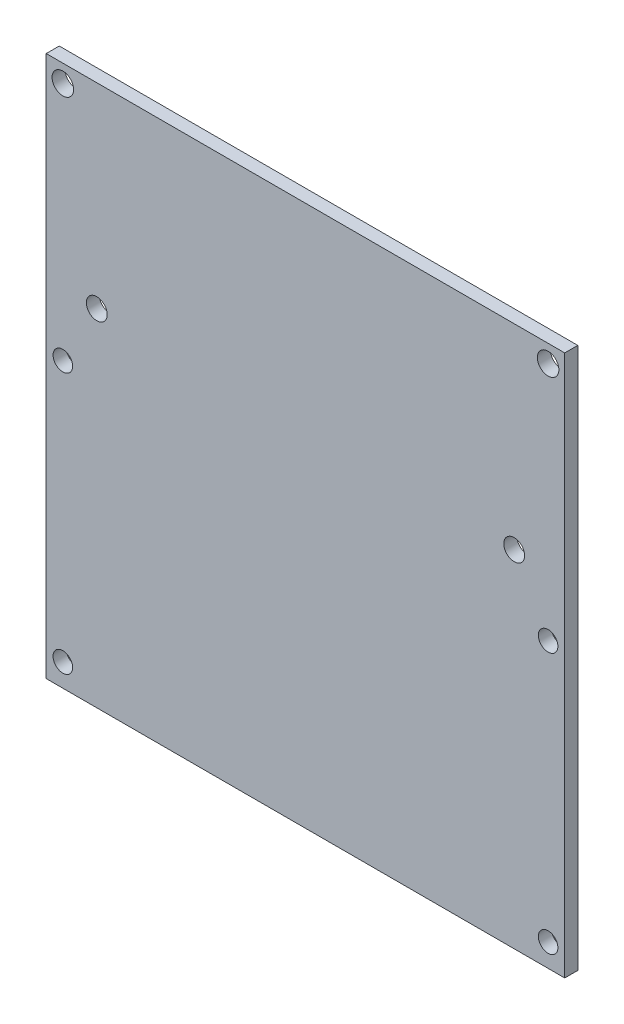
ISO-10303-21;
HEADER;
FILE_DESCRIPTION(('STEP AP214'),'2;1');
FILE_NAME('part.step','',(''),(''),'','','');
FILE_SCHEMA(('AUTOMOTIVE_DESIGN { 1 0 10303 214 1 1 1 1 }'));
ENDSEC;
DATA;
#1=APPLICATION_CONTEXT('core data for automotive mechanical design processes');
#2=APPLICATION_PROTOCOL_DEFINITION('international standard','automotive_design',2000,#1);
#3=PRODUCT_CONTEXT('',#1,'mechanical');
#4=PRODUCT('Part','Part','',(#3));
#5=PRODUCT_RELATED_PRODUCT_CATEGORY('part','',(#4));
#6=PRODUCT_DEFINITION_FORMATION('','',#4);
#7=PRODUCT_DEFINITION_CONTEXT('part definition',#1,'design');
#8=PRODUCT_DEFINITION('design','',#6,#7);
#9=PRODUCT_DEFINITION_SHAPE('','',#8);
#10=(LENGTH_UNIT() NAMED_UNIT(*) SI_UNIT(.MILLI.,.METRE.));
#11=(NAMED_UNIT(*) PLANE_ANGLE_UNIT() SI_UNIT($,.RADIAN.));
#12=(NAMED_UNIT(*) SI_UNIT($,.STERADIAN.) SOLID_ANGLE_UNIT());
#13=UNCERTAINTY_MEASURE_WITH_UNIT(LENGTH_MEASURE(1.E-05),#10,'distance_accuracy_value','');
#14=(GEOMETRIC_REPRESENTATION_CONTEXT(3) GLOBAL_UNCERTAINTY_ASSIGNED_CONTEXT((#13)) GLOBAL_UNIT_ASSIGNED_CONTEXT((#10,
#11,#12)) REPRESENTATION_CONTEXT('',''));
#15=CARTESIAN_POINT('',(0.,0.,0.));
#16=DIRECTION('',(0.,0.,1.));
#17=DIRECTION('',(1.,0.,0.));
#18=AXIS2_PLACEMENT_3D('',#15,#16,#17);
#19=CARTESIAN_POINT('',(0.,0.,2.));
#20=DIRECTION('',(0.,-1.,0.));
#21=DIRECTION('',(0.,0.,-1.));
#22=AXIS2_PLACEMENT_3D('',#19,#20,#21);
#23=PLANE('',#22);
#24=DIRECTION('',(-1.,0.,0.));
#25=VECTOR('',#24,1.);
#26=CARTESIAN_POINT('',(0.,0.,0.));
#27=LINE('',#26,#25);
#28=CARTESIAN_POINT('',(79.5,0.,0.));
#29=VERTEX_POINT('',#28);
#30=CARTESIAN_POINT('',(0.,0.,0.));
#31=VERTEX_POINT('',#30);
#32=EDGE_CURVE('E116',#29,#31,#27,.T.);
#33=ORIENTED_EDGE('',*,*,#32,.T.);
#34=DIRECTION('',(0.,0.,-1.));
#35=VECTOR('',#34,1.);
#36=CARTESIAN_POINT('',(0.,0.,2.));
#37=LINE('',#36,#35);
#38=CARTESIAN_POINT('',(0.,0.,2.));
#39=VERTEX_POINT('',#38);
#40=EDGE_CURVE('E11',#39,#31,#37,.T.);
#41=ORIENTED_EDGE('',*,*,#40,.F.);
#42=DIRECTION('',(-1.,0.,0.));
#43=VECTOR('',#42,1.);
#44=CARTESIAN_POINT('',(0.,0.,2.));
#45=LINE('',#44,#43);
#46=CARTESIAN_POINT('',(79.5,0.,2.));
#47=VERTEX_POINT('',#46);
#48=EDGE_CURVE('E99',#47,#39,#45,.T.);
#49=ORIENTED_EDGE('',*,*,#48,.F.);
#50=DIRECTION('',(0.,0.,-1.));
#51=VECTOR('',#50,1.);
#52=CARTESIAN_POINT('',(79.5,0.,2.));
#53=LINE('',#52,#51);
#54=EDGE_CURVE('E112',#47,#29,#53,.T.);
#55=ORIENTED_EDGE('',*,*,#54,.T.);
#56=EDGE_LOOP('',(#33,#41,#49,#55));
#57=FACE_BOUND('',#56,.T.);
#58=ADVANCED_FACE('F45',(#57),#23,.F.);
#59=CARTESIAN_POINT('',(0.,0.,2.));
#60=DIRECTION('',(1.,0.,0.));
#61=DIRECTION('',(0.,1.,0.));
#62=AXIS2_PLACEMENT_3D('',#59,#60,#61);
#63=PLANE('',#62);
#64=DIRECTION('',(0.,-1.,0.));
#65=VECTOR('',#64,1.);
#66=CARTESIAN_POINT('',(0.,0.,0.));
#67=LINE('',#66,#65);
#68=CARTESIAN_POINT('',(0.,-83.,0.));
#69=VERTEX_POINT('',#68);
#70=EDGE_CURVE('E104',#31,#69,#67,.T.);
#71=ORIENTED_EDGE('',*,*,#70,.T.);
#72=DIRECTION('',(0.,0.,-1.));
#73=VECTOR('',#72,1.);
#74=CARTESIAN_POINT('',(0.,-83.,2.));
#75=LINE('',#74,#73);
#76=CARTESIAN_POINT('',(0.,-83.,2.));
#77=VERTEX_POINT('',#76);
#78=EDGE_CURVE('E55',#77,#69,#75,.T.);
#79=ORIENTED_EDGE('',*,*,#78,.F.);
#80=DIRECTION('',(0.,-1.,0.));
#81=VECTOR('',#80,1.);
#82=CARTESIAN_POINT('',(0.,0.,2.));
#83=LINE('',#82,#81);
#84=EDGE_CURVE('E94',#39,#77,#83,.T.);
#85=ORIENTED_EDGE('',*,*,#84,.F.);
#86=ORIENTED_EDGE('',*,*,#40,.T.);
#87=EDGE_LOOP('',(#71,#79,#85,#86));
#88=FACE_BOUND('',#87,.T.);
#89=ADVANCED_FACE('F103',(#88),#63,.F.);
#90=CARTESIAN_POINT('',(79.5,-83.,2.));
#91=DIRECTION('',(0.,1.,0.));
#92=DIRECTION('',(0.,0.,1.));
#93=AXIS2_PLACEMENT_3D('',#90,#91,#92);
#94=PLANE('',#93);
#95=DIRECTION('',(1.,0.,0.));
#96=VECTOR('',#95,1.);
#97=CARTESIAN_POINT('',(79.5,-83.,0.));
#98=LINE('',#97,#96);
#99=CARTESIAN_POINT('',(79.5,-83.,0.));
#100=VERTEX_POINT('',#99);
#101=EDGE_CURVE('E81',#69,#100,#98,.T.);
#102=ORIENTED_EDGE('',*,*,#101,.T.);
#103=DIRECTION('',(0.,0.,-1.));
#104=VECTOR('',#103,1.);
#105=CARTESIAN_POINT('',(79.5,-83.,2.));
#106=LINE('',#105,#104);
#107=CARTESIAN_POINT('',(79.5,-83.,2.));
#108=VERTEX_POINT('',#107);
#109=EDGE_CURVE('E106',#108,#100,#106,.T.);
#110=ORIENTED_EDGE('',*,*,#109,.F.);
#111=DIRECTION('',(1.,0.,0.));
#112=VECTOR('',#111,1.);
#113=CARTESIAN_POINT('',(79.5,-83.,2.));
#114=LINE('',#113,#112);
#115=EDGE_CURVE('E97',#77,#108,#114,.T.);
#116=ORIENTED_EDGE('',*,*,#115,.F.);
#117=ORIENTED_EDGE('',*,*,#78,.T.);
#118=EDGE_LOOP('',(#102,#110,#116,#117));
#119=FACE_BOUND('',#118,.T.);
#120=ADVANCED_FACE('F108',(#119),#94,.F.);
#121=CARTESIAN_POINT('',(79.5,0.,2.));
#122=DIRECTION('',(-1.,0.,0.));
#123=DIRECTION('',(0.,0.,1.));
#124=AXIS2_PLACEMENT_3D('',#121,#122,#123);
#125=PLANE('',#124);
#126=DIRECTION('',(0.,1.,0.));
#127=VECTOR('',#126,1.);
#128=CARTESIAN_POINT('',(79.5,0.,0.));
#129=LINE('',#128,#127);
#130=EDGE_CURVE('E87',#100,#29,#129,.T.);
#131=ORIENTED_EDGE('',*,*,#130,.T.);
#132=ORIENTED_EDGE('',*,*,#54,.F.);
#133=DIRECTION('',(0.,1.,0.));
#134=VECTOR('',#133,1.);
#135=CARTESIAN_POINT('',(79.5,0.,2.));
#136=LINE('',#135,#134);
#137=EDGE_CURVE('E64',#108,#47,#136,.T.);
#138=ORIENTED_EDGE('',*,*,#137,.F.);
#139=ORIENTED_EDGE('',*,*,#109,.T.);
#140=EDGE_LOOP('',(#131,#132,#138,#139));
#141=FACE_BOUND('',#140,.T.);
#142=ADVANCED_FACE('F175',(#141),#125,.F.);
#143=CARTESIAN_POINT('',(0.,0.,2.));
#144=DIRECTION('',(0.,0.,-1.));
#145=DIRECTION('',(-1.,0.,0.));
#146=AXIS2_PLACEMENT_3D('',#143,#144,#145);
#147=PLANE('',#146);
#148=CARTESIAN_POINT('',(7.75000000000001,-30.,2.));
#149=DIRECTION('',(0.,0.,-1.));
#150=DIRECTION('',(-1.,0.,0.));
#151=AXIS2_PLACEMENT_3D('',#148,#149,#150);
#152=CIRCLE('',#151,1.6);
#153=CARTESIAN_POINT('',(6.15000000000001,-30.,2.));
#154=VERTEX_POINT('',#153);
#155=EDGE_CURVE('E298',#154,#154,#152,.T.);
#156=ORIENTED_EDGE('',*,*,#155,.T.);
#157=EDGE_LOOP('',(#156));
#158=FACE_BOUND('',#157,.T.);
#159=CARTESIAN_POINT('',(71.75,-30.,2.));
#160=DIRECTION('',(0.,0.,-1.));
#161=DIRECTION('',(-1.,0.,0.));
#162=AXIS2_PLACEMENT_3D('',#159,#160,#161);
#163=CIRCLE('',#162,1.6);
#164=CARTESIAN_POINT('',(70.15,-30.,2.));
#165=VERTEX_POINT('',#164);
#166=EDGE_CURVE('E300',#165,#165,#163,.T.);
#167=ORIENTED_EDGE('',*,*,#166,.T.);
#168=EDGE_LOOP('',(#167));
#169=FACE_BOUND('',#168,.T.);
#170=CARTESIAN_POINT('',(2.55,-2.7,2.));
#171=DIRECTION('',(0.,0.,1.));
#172=DIRECTION('',(1.,0.,0.));
#173=AXIS2_PLACEMENT_3D('',#170,#171,#172);
#174=CIRCLE('',#173,1.65);
#175=CARTESIAN_POINT('',(4.2,-2.7,2.));
#176=VERTEX_POINT('',#175);
#177=EDGE_CURVE('E316',#176,#176,#174,.T.);
#178=ORIENTED_EDGE('',*,*,#177,.F.);
#179=EDGE_LOOP('',(#178));
#180=FACE_BOUND('',#179,.T.);
#181=CARTESIAN_POINT('',(76.95,-79.5,2.));
#182=DIRECTION('',(0.,0.,1.));
#183=DIRECTION('',(1.,0.,0.));
#184=AXIS2_PLACEMENT_3D('',#181,#182,#183);
#185=CIRCLE('',#184,1.5);
#186=CARTESIAN_POINT('',(78.45,-79.5,2.));
#187=VERTEX_POINT('',#186);
#188=EDGE_CURVE('E317',#187,#187,#185,.T.);
#189=ORIENTED_EDGE('',*,*,#188,.F.);
#190=EDGE_LOOP('',(#189));
#191=FACE_BOUND('',#190,.T.);
#192=CARTESIAN_POINT('',(76.95,-39.5,2.));
#193=DIRECTION('',(0.,0.,1.));
#194=DIRECTION('',(1.,0.,0.));
#195=AXIS2_PLACEMENT_3D('',#192,#193,#194);
#196=CIRCLE('',#195,1.5);
#197=CARTESIAN_POINT('',(78.45,-39.5,2.));
#198=VERTEX_POINT('',#197);
#199=EDGE_CURVE('E321',#198,#198,#196,.T.);
#200=ORIENTED_EDGE('',*,*,#199,.F.);
#201=EDGE_LOOP('',(#200));
#202=FACE_BOUND('',#201,.T.);
#203=CARTESIAN_POINT('',(2.55000000000001,-39.5,2.));
#204=DIRECTION('',(0.,0.,1.));
#205=DIRECTION('',(1.,0.,0.));
#206=AXIS2_PLACEMENT_3D('',#203,#204,#205);
#207=CIRCLE('',#206,1.5);
#208=CARTESIAN_POINT('',(4.05000000000001,-39.5,2.));
#209=VERTEX_POINT('',#208);
#210=EDGE_CURVE('E325',#209,#209,#207,.T.);
#211=ORIENTED_EDGE('',*,*,#210,.F.);
#212=EDGE_LOOP('',(#211));
#213=FACE_BOUND('',#212,.T.);
#214=CARTESIAN_POINT('',(76.95,-2.7,2.));
#215=DIRECTION('',(0.,0.,1.));
#216=DIRECTION('',(-1.,0.,0.));
#217=AXIS2_PLACEMENT_3D('',#214,#215,#216);
#218=CIRCLE('',#217,1.65);
#219=CARTESIAN_POINT('',(75.3,-2.7,2.));
#220=VERTEX_POINT('',#219);
#221=EDGE_CURVE('E304',#220,#220,#218,.T.);
#222=ORIENTED_EDGE('',*,*,#221,.F.);
#223=EDGE_LOOP('',(#222));
#224=FACE_BOUND('',#223,.T.);
#225=CARTESIAN_POINT('',(2.55000000000001,-79.5,2.));
#226=DIRECTION('',(0.,0.,1.));
#227=DIRECTION('',(1.,0.,0.));
#228=AXIS2_PLACEMENT_3D('',#225,#226,#227);
#229=CIRCLE('',#228,1.5);
#230=CARTESIAN_POINT('',(4.05000000000001,-79.5,2.));
#231=VERTEX_POINT('',#230);
#232=EDGE_CURVE('E135',#231,#231,#229,.T.);
#233=ORIENTED_EDGE('',*,*,#232,.F.);
#234=EDGE_LOOP('',(#233));
#235=FACE_BOUND('',#234,.T.);
#236=ORIENTED_EDGE('',*,*,#48,.T.);
#237=ORIENTED_EDGE('',*,*,#84,.T.);
#238=ORIENTED_EDGE('',*,*,#115,.T.);
#239=ORIENTED_EDGE('',*,*,#137,.T.);
#240=EDGE_LOOP('',(#236,#237,#238,#239));
#241=FACE_BOUND('',#240,.T.);
#242=ADVANCED_FACE('F95',(#158,#169,#180,#191,#202,#213,#224,#235,#241),#147,.F.);
#243=CARTESIAN_POINT('',(0.,0.,0.));
#244=DIRECTION('',(0.,0.,-1.));
#245=DIRECTION('',(-1.,0.,0.));
#246=AXIS2_PLACEMENT_3D('',#243,#244,#245);
#247=PLANE('',#246);
#248=CARTESIAN_POINT('',(7.75000000000001,-30.,0.));
#249=DIRECTION('',(0.,0.,1.));
#250=DIRECTION('',(1.,0.,0.));
#251=AXIS2_PLACEMENT_3D('',#248,#249,#250);
#252=CIRCLE('',#251,1.6);
#253=CARTESIAN_POINT('',(9.35000000000001,-30.,0.));
#254=VERTEX_POINT('',#253);
#255=EDGE_CURVE('E295',#254,#254,#252,.T.);
#256=ORIENTED_EDGE('',*,*,#255,.T.);
#257=EDGE_LOOP('',(#256));
#258=FACE_BOUND('',#257,.T.);
#259=CARTESIAN_POINT('',(71.75,-30.,0.));
#260=DIRECTION('',(0.,0.,1.));
#261=DIRECTION('',(-1.,0.,0.));
#262=AXIS2_PLACEMENT_3D('',#259,#260,#261);
#263=CIRCLE('',#262,1.6);
#264=CARTESIAN_POINT('',(70.15,-30.,0.));
#265=VERTEX_POINT('',#264);
#266=EDGE_CURVE('E307',#265,#265,#263,.T.);
#267=ORIENTED_EDGE('',*,*,#266,.T.);
#268=EDGE_LOOP('',(#267));
#269=FACE_BOUND('',#268,.T.);
#270=CARTESIAN_POINT('',(2.55,-2.7,0.));
#271=DIRECTION('',(0.,0.,-1.));
#272=DIRECTION('',(-1.,0.,0.));
#273=AXIS2_PLACEMENT_3D('',#270,#271,#272);
#274=CIRCLE('',#273,1.65);
#275=CARTESIAN_POINT('',(0.899999999999996,-2.7,0.));
#276=VERTEX_POINT('',#275);
#277=EDGE_CURVE('E48',#276,#276,#274,.T.);
#278=ORIENTED_EDGE('',*,*,#277,.F.);
#279=EDGE_LOOP('',(#278));
#280=FACE_BOUND('',#279,.T.);
#281=CARTESIAN_POINT('',(76.95,-79.5,0.));
#282=DIRECTION('',(0.,0.,-1.));
#283=DIRECTION('',(-1.,0.,0.));
#284=AXIS2_PLACEMENT_3D('',#281,#282,#283);
#285=CIRCLE('',#284,1.5);
#286=CARTESIAN_POINT('',(75.45,-79.5,0.));
#287=VERTEX_POINT('',#286);
#288=EDGE_CURVE('E146',#287,#287,#285,.T.);
#289=ORIENTED_EDGE('',*,*,#288,.F.);
#290=EDGE_LOOP('',(#289));
#291=FACE_BOUND('',#290,.T.);
#292=CARTESIAN_POINT('',(76.95,-39.5,0.));
#293=DIRECTION('',(0.,0.,-1.));
#294=DIRECTION('',(-1.,0.,0.));
#295=AXIS2_PLACEMENT_3D('',#292,#293,#294);
#296=CIRCLE('',#295,1.5);
#297=CARTESIAN_POINT('',(75.45,-39.5,0.));
#298=VERTEX_POINT('',#297);
#299=EDGE_CURVE('E143',#298,#298,#296,.T.);
#300=ORIENTED_EDGE('',*,*,#299,.F.);
#301=EDGE_LOOP('',(#300));
#302=FACE_BOUND('',#301,.T.);
#303=CARTESIAN_POINT('',(2.55000000000001,-39.5,0.));
#304=DIRECTION('',(0.,0.,-1.));
#305=DIRECTION('',(-1.,0.,0.));
#306=AXIS2_PLACEMENT_3D('',#303,#304,#305);
#307=CIRCLE('',#306,1.5);
#308=CARTESIAN_POINT('',(1.05000000000001,-39.5,0.));
#309=VERTEX_POINT('',#308);
#310=EDGE_CURVE('E139',#309,#309,#307,.T.);
#311=ORIENTED_EDGE('',*,*,#310,.F.);
#312=EDGE_LOOP('',(#311));
#313=FACE_BOUND('',#312,.T.);
#314=CARTESIAN_POINT('',(76.95,-2.7,0.));
#315=DIRECTION('',(0.,0.,-1.));
#316=DIRECTION('',(-1.,0.,0.));
#317=AXIS2_PLACEMENT_3D('',#314,#315,#316);
#318=CIRCLE('',#317,1.65);
#319=CARTESIAN_POINT('',(75.3,-2.7,0.));
#320=VERTEX_POINT('',#319);
#321=EDGE_CURVE('E134',#320,#320,#318,.T.);
#322=ORIENTED_EDGE('',*,*,#321,.F.);
#323=EDGE_LOOP('',(#322));
#324=FACE_BOUND('',#323,.T.);
#325=CARTESIAN_POINT('',(2.55000000000001,-79.5,0.));
#326=DIRECTION('',(0.,0.,-1.));
#327=DIRECTION('',(-1.,0.,0.));
#328=AXIS2_PLACEMENT_3D('',#325,#326,#327);
#329=CIRCLE('',#328,1.5);
#330=CARTESIAN_POINT('',(1.05000000000001,-79.5,0.));
#331=VERTEX_POINT('',#330);
#332=EDGE_CURVE('E130',#331,#331,#329,.T.);
#333=ORIENTED_EDGE('',*,*,#332,.F.);
#334=EDGE_LOOP('',(#333));
#335=FACE_BOUND('',#334,.T.);
#336=ORIENTED_EDGE('',*,*,#32,.F.);
#337=ORIENTED_EDGE('',*,*,#130,.F.);
#338=ORIENTED_EDGE('',*,*,#101,.F.);
#339=ORIENTED_EDGE('',*,*,#70,.F.);
#340=EDGE_LOOP('',(#336,#337,#338,#339));
#341=FACE_BOUND('',#340,.T.);
#342=ADVANCED_FACE('F158',(#258,#269,#280,#291,#302,#313,#324,#335,#341),#247,.T.);
#343=CARTESIAN_POINT('',(2.55000000000001,-79.5,-1.));
#344=DIRECTION('',(0.,0.,1.));
#345=DIRECTION('',(1.,0.,0.));
#346=AXIS2_PLACEMENT_3D('',#343,#344,#345);
#347=CYLINDRICAL_SURFACE('',#346,1.5);
#348=ORIENTED_EDGE('',*,*,#332,.T.);
#349=EDGE_LOOP('',(#348));
#350=FACE_BOUND('',#349,.T.);
#351=ORIENTED_EDGE('',*,*,#232,.T.);
#352=EDGE_LOOP('',(#351));
#353=FACE_BOUND('',#352,.T.);
#354=ADVANCED_FACE('F161',(#350,#353),#347,.F.);
#355=CARTESIAN_POINT('',(76.95,-2.7,-1.));
#356=DIRECTION('',(0.,0.,1.));
#357=DIRECTION('',(1.,0.,0.));
#358=AXIS2_PLACEMENT_3D('',#355,#356,#357);
#359=CYLINDRICAL_SURFACE('',#358,1.65);
#360=ORIENTED_EDGE('',*,*,#321,.T.);
#361=EDGE_LOOP('',(#360));
#362=FACE_BOUND('',#361,.T.);
#363=ORIENTED_EDGE('',*,*,#221,.T.);
#364=EDGE_LOOP('',(#363));
#365=FACE_BOUND('',#364,.T.);
#366=ADVANCED_FACE('F224',(#362,#365),#359,.F.);
#367=CARTESIAN_POINT('',(2.55000000000001,-39.5,-1.));
#368=DIRECTION('',(0.,0.,1.));
#369=DIRECTION('',(1.,0.,0.));
#370=AXIS2_PLACEMENT_3D('',#367,#368,#369);
#371=CYLINDRICAL_SURFACE('',#370,1.5);
#372=ORIENTED_EDGE('',*,*,#310,.T.);
#373=EDGE_LOOP('',(#372));
#374=FACE_BOUND('',#373,.T.);
#375=ORIENTED_EDGE('',*,*,#210,.T.);
#376=EDGE_LOOP('',(#375));
#377=FACE_BOUND('',#376,.T.);
#378=ADVANCED_FACE('F234',(#374,#377),#371,.F.);
#379=CARTESIAN_POINT('',(76.95,-39.5,-1.));
#380=DIRECTION('',(0.,0.,1.));
#381=DIRECTION('',(1.,0.,0.));
#382=AXIS2_PLACEMENT_3D('',#379,#380,#381);
#383=CYLINDRICAL_SURFACE('',#382,1.5);
#384=ORIENTED_EDGE('',*,*,#299,.T.);
#385=EDGE_LOOP('',(#384));
#386=FACE_BOUND('',#385,.T.);
#387=ORIENTED_EDGE('',*,*,#199,.T.);
#388=EDGE_LOOP('',(#387));
#389=FACE_BOUND('',#388,.T.);
#390=ADVANCED_FACE('F244',(#386,#389),#383,.F.);
#391=CARTESIAN_POINT('',(76.95,-79.5,-1.));
#392=DIRECTION('',(0.,0.,1.));
#393=DIRECTION('',(1.,0.,0.));
#394=AXIS2_PLACEMENT_3D('',#391,#392,#393);
#395=CYLINDRICAL_SURFACE('',#394,1.5);
#396=ORIENTED_EDGE('',*,*,#288,.T.);
#397=EDGE_LOOP('',(#396));
#398=FACE_BOUND('',#397,.T.);
#399=ORIENTED_EDGE('',*,*,#188,.T.);
#400=EDGE_LOOP('',(#399));
#401=FACE_BOUND('',#400,.T.);
#402=ADVANCED_FACE('F254',(#398,#401),#395,.F.);
#403=CARTESIAN_POINT('',(2.55,-2.7,-1.));
#404=DIRECTION('',(0.,0.,1.));
#405=DIRECTION('',(1.,0.,0.));
#406=AXIS2_PLACEMENT_3D('',#403,#404,#405);
#407=CYLINDRICAL_SURFACE('',#406,1.65);
#408=ORIENTED_EDGE('',*,*,#277,.T.);
#409=EDGE_LOOP('',(#408));
#410=FACE_BOUND('',#409,.T.);
#411=ORIENTED_EDGE('',*,*,#177,.T.);
#412=EDGE_LOOP('',(#411));
#413=FACE_BOUND('',#412,.T.);
#414=ADVANCED_FACE('F155',(#410,#413),#407,.F.);
#415=CARTESIAN_POINT('',(71.75,-30.,2.001));
#416=DIRECTION('',(0.,0.,-1.));
#417=DIRECTION('',(-1.,0.,0.));
#418=AXIS2_PLACEMENT_3D('',#415,#416,#417);
#419=CYLINDRICAL_SURFACE('',#418,1.6);
#420=ORIENTED_EDGE('',*,*,#266,.F.);
#421=EDGE_LOOP('',(#420));
#422=FACE_BOUND('',#421,.T.);
#423=ORIENTED_EDGE('',*,*,#166,.F.);
#424=EDGE_LOOP('',(#423));
#425=FACE_BOUND('',#424,.T.);
#426=ADVANCED_FACE('F271',(#422,#425),#419,.F.);
#427=CARTESIAN_POINT('',(7.75000000000001,-30.,2.001));
#428=DIRECTION('',(0.,0.,-1.));
#429=DIRECTION('',(-1.,0.,0.));
#430=AXIS2_PLACEMENT_3D('',#427,#428,#429);
#431=CYLINDRICAL_SURFACE('',#430,1.6);
#432=ORIENTED_EDGE('',*,*,#255,.F.);
#433=EDGE_LOOP('',(#432));
#434=FACE_BOUND('',#433,.T.);
#435=ORIENTED_EDGE('',*,*,#155,.F.);
#436=EDGE_LOOP('',(#435));
#437=FACE_BOUND('',#436,.T.);
#438=ADVANCED_FACE('F279',(#434,#437),#431,.F.);
#439=CLOSED_SHELL('',(#58,#89,#120,#142,#242,#342,#354,#366,#378,#390,#402,#414,#426,#438));
#440=MANIFOLD_SOLID_BREP('B2',#439);
#441=ADVANCED_BREP_SHAPE_REPRESENTATION('',(#18,#440),#14);
#442=SHAPE_DEFINITION_REPRESENTATION(#9,#441);
ENDSEC;
END-ISO-10303-21;
